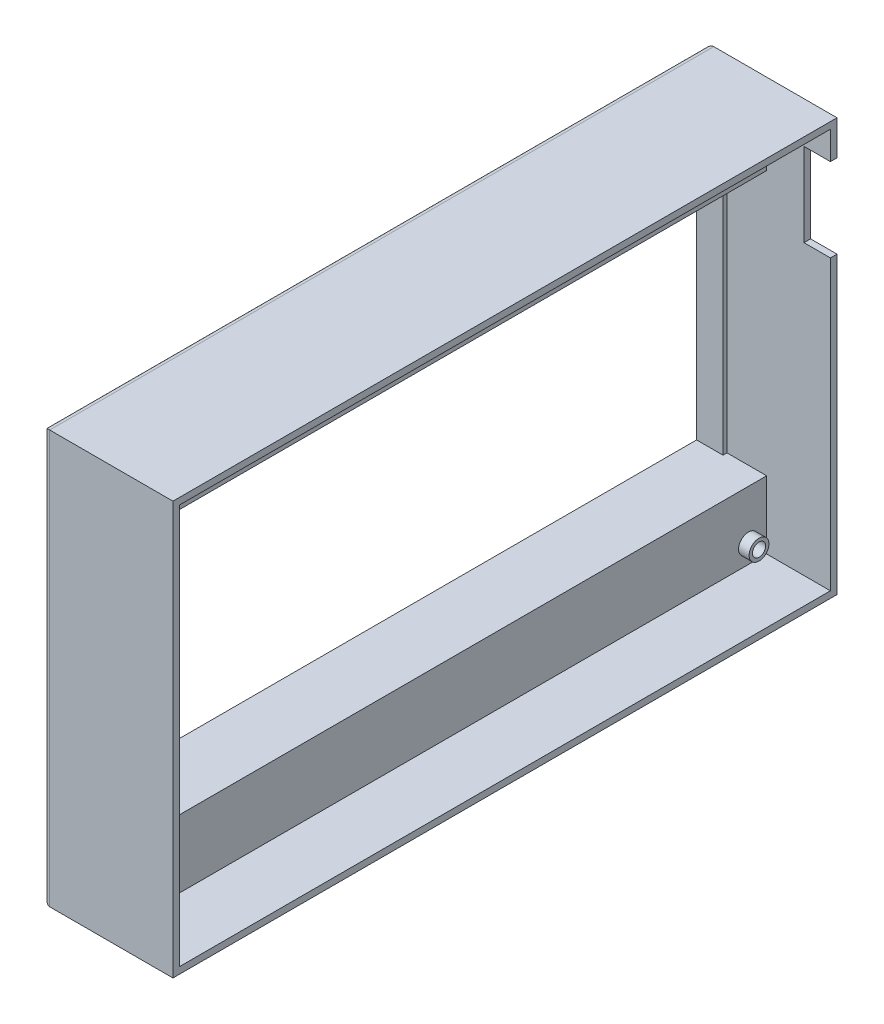
ISO-10303-21;
HEADER;
FILE_DESCRIPTION(('STEP AP214'),'2;1');
FILE_NAME('part.step','',(''),(''),'','','');
FILE_SCHEMA(('AUTOMOTIVE_DESIGN { 1 0 10303 214 1 1 1 1 }'));
ENDSEC;
DATA;
#1=APPLICATION_CONTEXT('core data for automotive mechanical design processes');
#2=APPLICATION_PROTOCOL_DEFINITION('international standard','automotive_design',2000,#1);
#3=PRODUCT_CONTEXT('',#1,'mechanical');
#4=PRODUCT('Part','Part','',(#3));
#5=PRODUCT_RELATED_PRODUCT_CATEGORY('part','',(#4));
#6=PRODUCT_DEFINITION_FORMATION('','',#4);
#7=PRODUCT_DEFINITION_CONTEXT('part definition',#1,'design');
#8=PRODUCT_DEFINITION('design','',#6,#7);
#9=PRODUCT_DEFINITION_SHAPE('','',#8);
#10=(LENGTH_UNIT() NAMED_UNIT(*) SI_UNIT(.MILLI.,.METRE.));
#11=(NAMED_UNIT(*) PLANE_ANGLE_UNIT() SI_UNIT($,.RADIAN.));
#12=(NAMED_UNIT(*) SI_UNIT($,.STERADIAN.) SOLID_ANGLE_UNIT());
#13=UNCERTAINTY_MEASURE_WITH_UNIT(LENGTH_MEASURE(1.E-05),#10,'distance_accuracy_value','');
#14=(GEOMETRIC_REPRESENTATION_CONTEXT(3) GLOBAL_UNCERTAINTY_ASSIGNED_CONTEXT((#13)) GLOBAL_UNIT_ASSIGNED_CONTEXT((#10,
#11,#12)) REPRESENTATION_CONTEXT('',''));
#15=CARTESIAN_POINT('',(0.,0.,0.));
#16=DIRECTION('',(0.,0.,1.));
#17=DIRECTION('',(1.,0.,0.));
#18=AXIS2_PLACEMENT_3D('',#15,#16,#17);
#19=CARTESIAN_POINT('',(19.65,26.394578313253,-54.8336983050815));
#20=DIRECTION('',(0.,0.,-1.));
#21=DIRECTION('',(0.,1.,0.));
#22=AXIS2_PLACEMENT_3D('',#19,#20,#21);
#23=PLANE('',#22);
#24=DIRECTION('',(0.,-1.,0.));
#25=VECTOR('',#24,1.);
#26=CARTESIAN_POINT('',(19.65,26.394578313253,-54.8336983050815));
#27=LINE('',#26,#25);
#28=CARTESIAN_POINT('',(19.65,9.52457831325301,-54.8336983050815));
#29=VERTEX_POINT('',#28);
#30=CARTESIAN_POINT('',(19.65,-34.105421686747,-54.8336983050815));
#31=VERTEX_POINT('',#30);
#32=EDGE_CURVE('E210',#29,#31,#27,.T.);
#33=ORIENTED_EDGE('',*,*,#32,.F.);
#34=DIRECTION('',(1.,0.,0.));
#35=VECTOR('',#34,1.);
#36=CARTESIAN_POINT('',(15.65,9.52457831325301,-54.8336983050815));
#37=LINE('',#36,#35);
#38=CARTESIAN_POINT('',(15.65,9.52457831325301,-54.8336983050815));
#39=VERTEX_POINT('',#38);
#40=EDGE_CURVE('E202',#39,#29,#37,.T.);
#41=ORIENTED_EDGE('',*,*,#40,.F.);
#42=DIRECTION('',(0.,1.,0.));
#43=VECTOR('',#42,1.);
#44=CARTESIAN_POINT('',(15.65,26.394578313253,-54.8336983050815));
#45=LINE('',#44,#43);
#46=CARTESIAN_POINT('',(15.65,22.144578313253,-54.8336983050815));
#47=VERTEX_POINT('',#46);
#48=EDGE_CURVE('E187',#39,#47,#45,.T.);
#49=ORIENTED_EDGE('',*,*,#48,.T.);
#50=DIRECTION('',(1.,0.,0.));
#51=VECTOR('',#50,1.);
#52=CARTESIAN_POINT('',(19.65,22.144578313253,-54.8336983050815));
#53=LINE('',#52,#51);
#54=CARTESIAN_POINT('',(19.65,22.144578313253,-54.8336983050815));
#55=VERTEX_POINT('',#54);
#56=EDGE_CURVE('E197',#47,#55,#53,.T.);
#57=ORIENTED_EDGE('',*,*,#56,.T.);
#58=CARTESIAN_POINT('',(19.65,26.394578313253,-54.8336983050815));
#59=VERTEX_POINT('',#58);
#60=EDGE_CURVE('E312',#59,#55,#27,.T.);
#61=ORIENTED_EDGE('',*,*,#60,.F.);
#62=DIRECTION('',(-1.,0.,0.));
#63=VECTOR('',#62,1.);
#64=CARTESIAN_POINT('',(19.65,26.394578313253,-54.8336983050815));
#65=LINE('',#64,#63);
#66=CARTESIAN_POINT('',(10.,26.394578313253,-54.8336983050815));
#67=VERTEX_POINT('',#66);
#68=EDGE_CURVE('E325',#59,#67,#65,.T.);
#69=ORIENTED_EDGE('',*,*,#68,.T.);
#70=DIRECTION('',(0.,-1.,0.));
#71=VECTOR('',#70,1.);
#72=CARTESIAN_POINT('',(10.,26.394578313253,-54.8336983050815));
#73=LINE('',#72,#71);
#74=CARTESIAN_POINT('',(10.,16.144578313253,-54.8336983050815));
#75=VERTEX_POINT('',#74);
#76=EDGE_CURVE('E296',#67,#75,#73,.T.);
#77=ORIENTED_EDGE('',*,*,#76,.T.);
#78=DIRECTION('',(-1.,0.,0.));
#79=VECTOR('',#78,1.);
#80=CARTESIAN_POINT('',(10.,16.144578313253,-54.8336983050815));
#81=LINE('',#80,#79);
#82=CARTESIAN_POINT('',(4.,16.144578313253,-54.8336983050815));
#83=VERTEX_POINT('',#82);
#84=EDGE_CURVE('E304',#75,#83,#81,.T.);
#85=ORIENTED_EDGE('',*,*,#84,.T.);
#86=DIRECTION('',(0.,-1.,0.));
#87=VECTOR('',#86,1.);
#88=CARTESIAN_POINT('',(4.,-24.4397467502218,-54.8336983050815));
#89=LINE('',#88,#87);
#90=CARTESIAN_POINT('',(4.,-23.855421686747,-54.8336983050815));
#91=VERTEX_POINT('',#90);
#92=EDGE_CURVE('E248',#83,#91,#89,.T.);
#93=ORIENTED_EDGE('',*,*,#92,.T.);
#94=DIRECTION('',(-1.,0.,0.));
#95=VECTOR('',#94,1.);
#96=CARTESIAN_POINT('',(10.,-23.855421686747,-54.8336983050815));
#97=LINE('',#96,#95);
#98=CARTESIAN_POINT('',(10.,-23.855421686747,-54.8336983050815));
#99=VERTEX_POINT('',#98);
#100=EDGE_CURVE('E278',#99,#91,#97,.T.);
#101=ORIENTED_EDGE('',*,*,#100,.F.);
#102=DIRECTION('',(0.,-1.,0.));
#103=VECTOR('',#102,1.);
#104=CARTESIAN_POINT('',(10.,-23.855421686747,-54.8336983050815));
#105=LINE('',#104,#103);
#106=CARTESIAN_POINT('',(10.,-34.105421686747,-54.8336983050815));
#107=VERTEX_POINT('',#106);
#108=EDGE_CURVE('E268',#99,#107,#105,.T.);
#109=ORIENTED_EDGE('',*,*,#108,.T.);
#110=DIRECTION('',(-1.,0.,0.));
#111=VECTOR('',#110,1.);
#112=CARTESIAN_POINT('',(19.65,-34.105421686747,-54.8336983050815));
#113=LINE('',#112,#111);
#114=EDGE_CURVE('E324',#31,#107,#113,.T.);
#115=ORIENTED_EDGE('',*,*,#114,.F.);
#116=EDGE_LOOP('',(#33,#41,#49,#57,#61,#69,#77,#85,#93,#101,#109,#115));
#117=FACE_BOUND('',#116,.T.);
#118=ADVANCED_FACE('F36',(#117),#23,.F.);
#119=CARTESIAN_POINT('',(19.65,-34.105421686747,-54.8336983050815));
#120=DIRECTION('',(0.,-1.,0.));
#121=DIRECTION('',(0.,0.,-1.));
#122=AXIS2_PLACEMENT_3D('',#119,#120,#121);
#123=PLANE('',#122);
#124=DIRECTION('',(0.,0.,1.));
#125=VECTOR('',#124,1.);
#126=CARTESIAN_POINT('',(10.,-34.105421686747,-54.8336983050815));
#127=LINE('',#126,#125);
#128=CARTESIAN_POINT('',(10.,-34.105421686747,43.6663016949185));
#129=VERTEX_POINT('',#128);
#130=EDGE_CURVE('E270',#107,#129,#127,.T.);
#131=ORIENTED_EDGE('',*,*,#130,.T.);
#132=DIRECTION('',(-1.,0.,0.));
#133=VECTOR('',#132,1.);
#134=CARTESIAN_POINT('',(19.65,-34.105421686747,43.6663016949185));
#135=LINE('',#134,#133);
#136=CARTESIAN_POINT('',(19.65,-34.105421686747,43.6663016949185));
#137=VERTEX_POINT('',#136);
#138=EDGE_CURVE('E332',#137,#129,#135,.T.);
#139=ORIENTED_EDGE('',*,*,#138,.F.);
#140=DIRECTION('',(0.,0.,1.));
#141=VECTOR('',#140,1.);
#142=CARTESIAN_POINT('',(19.65,-34.105421686747,-54.8336983050815));
#143=LINE('',#142,#141);
#144=EDGE_CURVE('E315',#31,#137,#143,.T.);
#145=ORIENTED_EDGE('',*,*,#144,.F.);
#146=ORIENTED_EDGE('',*,*,#114,.T.);
#147=EDGE_LOOP('',(#131,#139,#145,#146));
#148=FACE_BOUND('',#147,.T.);
#149=ADVANCED_FACE('F491',(#148),#123,.F.);
#150=CARTESIAN_POINT('',(10.,0.,0.));
#151=DIRECTION('',(-1.,0.,0.));
#152=DIRECTION('',(0.,0.,1.));
#153=AXIS2_PLACEMENT_3D('',#150,#151,#152);
#154=PLANE('',#153);
#155=DIRECTION('',(0.,1.,0.));
#156=VECTOR('',#155,1.);
#157=CARTESIAN_POINT('',(10.,26.394578313253,43.6663016949185));
#158=LINE('',#157,#156);
#159=CARTESIAN_POINT('',(10.,16.144578313253,43.6663016949185));
#160=VERTEX_POINT('',#159);
#161=CARTESIAN_POINT('',(10.,26.394578313253,43.6663016949185));
#162=VERTEX_POINT('',#161);
#163=EDGE_CURVE('E300',#160,#162,#158,.T.);
#164=ORIENTED_EDGE('',*,*,#163,.F.);
#165=DIRECTION('',(0.,0.,1.));
#166=VECTOR('',#165,1.);
#167=CARTESIAN_POINT('',(10.,16.144578313253,-54.8336983050815));
#168=LINE('',#167,#166);
#169=EDGE_CURVE('E298',#75,#160,#168,.T.);
#170=ORIENTED_EDGE('',*,*,#169,.F.);
#171=ORIENTED_EDGE('',*,*,#76,.F.);
#172=DIRECTION('',(0.,0.,-1.));
#173=VECTOR('',#172,1.);
#174=CARTESIAN_POINT('',(10.,26.394578313253,-54.8336983050815));
#175=LINE('',#174,#173);
#176=EDGE_CURVE('E302',#162,#67,#175,.T.);
#177=ORIENTED_EDGE('',*,*,#176,.F.);
#178=EDGE_LOOP('',(#164,#170,#171,#177));
#179=FACE_BOUND('',#178,.T.);
#180=CARTESIAN_POINT('',(10.,23.644578313253,-52.0836983050815));
#181=DIRECTION('',(-1.,0.,0.));
#182=DIRECTION('',(0.,0.,1.));
#183=AXIS2_PLACEMENT_3D('',#180,#181,#182);
#184=CIRCLE('',#183,1.5);
#185=CARTESIAN_POINT('',(10.,23.644578313253,-50.5836983050815));
#186=VERTEX_POINT('',#185);
#187=EDGE_CURVE('E365',#186,#186,#184,.F.);
#188=ORIENTED_EDGE('',*,*,#187,.F.);
#189=EDGE_LOOP('',(#188));
#190=FACE_BOUND('',#189,.T.);
#191=CARTESIAN_POINT('',(10.,23.644578313253,40.9163016949185));
#192=DIRECTION('',(-1.,0.,0.));
#193=DIRECTION('',(0.,0.,1.));
#194=AXIS2_PLACEMENT_3D('',#191,#192,#193);
#195=CIRCLE('',#194,1.5);
#196=CARTESIAN_POINT('',(10.,23.644578313253,42.4163016949185));
#197=VERTEX_POINT('',#196);
#198=EDGE_CURVE('E368',#197,#197,#195,.F.);
#199=ORIENTED_EDGE('',*,*,#198,.F.);
#200=EDGE_LOOP('',(#199));
#201=FACE_BOUND('',#200,.T.);
#202=ADVANCED_FACE('F482',(#179,#190,#201),#154,.F.);
#203=CARTESIAN_POINT('',(19.65,26.394578313253,-54.8336983050815));
#204=DIRECTION('',(0.,1.,0.));
#205=DIRECTION('',(0.,0.,1.));
#206=AXIS2_PLACEMENT_3D('',#203,#204,#205);
#207=PLANE('',#206);
#208=ORIENTED_EDGE('',*,*,#176,.T.);
#209=ORIENTED_EDGE('',*,*,#68,.F.);
#210=DIRECTION('',(0.,0.,-1.));
#211=VECTOR('',#210,1.);
#212=CARTESIAN_POINT('',(19.65,26.394578313253,-54.8336983050815));
#213=LINE('',#212,#211);
#214=CARTESIAN_POINT('',(19.65,26.394578313253,43.6663016949185));
#215=VERTEX_POINT('',#214);
#216=EDGE_CURVE('E321',#215,#59,#213,.T.);
#217=ORIENTED_EDGE('',*,*,#216,.F.);
#218=DIRECTION('',(-1.,0.,0.));
#219=VECTOR('',#218,1.);
#220=CARTESIAN_POINT('',(19.65,26.394578313253,43.6663016949185));
#221=LINE('',#220,#219);
#222=EDGE_CURVE('E329',#215,#162,#221,.T.);
#223=ORIENTED_EDGE('',*,*,#222,.T.);
#224=EDGE_LOOP('',(#208,#209,#217,#223));
#225=FACE_BOUND('',#224,.T.);
#226=ADVANCED_FACE('F487',(#225),#207,.F.);
#227=CARTESIAN_POINT('',(19.65,27.394578313253,-55.8336983050815));
#228=DIRECTION('',(0.,0.,-1.));
#229=DIRECTION('',(0.,1.,0.));
#230=AXIS2_PLACEMENT_3D('',#227,#228,#229);
#231=PLANE('',#230);
#232=DIRECTION('',(1.,0.,0.));
#233=VECTOR('',#232,1.);
#234=CARTESIAN_POINT('',(15.65,9.52457831325301,-55.8336983050815));
#235=LINE('',#234,#233);
#236=CARTESIAN_POINT('',(15.65,9.52457831325301,-55.8336983050815));
#237=VERTEX_POINT('',#236);
#238=CARTESIAN_POINT('',(19.65,9.52457831325301,-55.8336983050815));
#239=VERTEX_POINT('',#238);
#240=EDGE_CURVE('E205',#237,#239,#235,.T.);
#241=ORIENTED_EDGE('',*,*,#240,.T.);
#242=DIRECTION('',(0.,-1.,0.));
#243=VECTOR('',#242,1.);
#244=CARTESIAN_POINT('',(19.65,27.394578313253,-55.8336983050815));
#245=LINE('',#244,#243);
#246=CARTESIAN_POINT('',(19.65,-35.105421686747,-55.8336983050815));
#247=VERTEX_POINT('',#246);
#248=EDGE_CURVE('E328',#239,#247,#245,.T.);
#249=ORIENTED_EDGE('',*,*,#248,.T.);
#250=DIRECTION('',(-1.,0.,0.));
#251=VECTOR('',#250,1.);
#252=CARTESIAN_POINT('',(19.65,-35.105421686747,-55.8336983050815));
#253=LINE('',#252,#251);
#254=CARTESIAN_POINT('',(1.,-35.105421686747,-55.8336983050815));
#255=VERTEX_POINT('',#254);
#256=EDGE_CURVE('E349',#247,#255,#253,.T.);
#257=ORIENTED_EDGE('',*,*,#256,.T.);
#258=DIRECTION('',(0.,-1.,0.));
#259=VECTOR('',#258,1.);
#260=CARTESIAN_POINT('',(1.,27.394578313253,-55.8336983050815));
#261=LINE('',#260,#259);
#262=CARTESIAN_POINT('',(1.,27.394578313253,-55.8336983050815));
#263=VERTEX_POINT('',#262);
#264=EDGE_CURVE('E45',#255,#263,#261,.F.);
#265=ORIENTED_EDGE('',*,*,#264,.T.);
#266=DIRECTION('',(-1.,0.,0.));
#267=VECTOR('',#266,1.);
#268=CARTESIAN_POINT('',(19.65,27.394578313253,-55.8336983050815));
#269=LINE('',#268,#267);
#270=CARTESIAN_POINT('',(19.65,27.394578313253,-55.8336983050815));
#271=VERTEX_POINT('',#270);
#272=EDGE_CURVE('E350',#271,#263,#269,.T.);
#273=ORIENTED_EDGE('',*,*,#272,.F.);
#274=CARTESIAN_POINT('',(19.65,22.144578313253,-55.8336983050815));
#275=VERTEX_POINT('',#274);
#276=EDGE_CURVE('E337',#271,#275,#245,.T.);
#277=ORIENTED_EDGE('',*,*,#276,.T.);
#278=DIRECTION('',(1.,0.,0.));
#279=VECTOR('',#278,1.);
#280=CARTESIAN_POINT('',(15.65,22.144578313253,-55.8336983050815));
#281=LINE('',#280,#279);
#282=CARTESIAN_POINT('',(15.65,22.144578313253,-55.8336983050815));
#283=VERTEX_POINT('',#282);
#284=EDGE_CURVE('E53',#283,#275,#281,.T.);
#285=ORIENTED_EDGE('',*,*,#284,.F.);
#286=DIRECTION('',(0.,1.,0.));
#287=VECTOR('',#286,1.);
#288=CARTESIAN_POINT('',(15.65,22.144578313253,-55.8336983050815));
#289=LINE('',#288,#287);
#290=EDGE_CURVE('E217',#237,#283,#289,.T.);
#291=ORIENTED_EDGE('',*,*,#290,.F.);
#292=EDGE_LOOP('',(#241,#249,#257,#265,#273,#277,#285,#291));
#293=FACE_BOUND('',#292,.T.);
#294=ADVANCED_FACE('F431',(#293),#231,.T.);
#295=CARTESIAN_POINT('',(19.65,27.394578313253,-55.8336983050815));
#296=DIRECTION('',(0.,1.,0.));
#297=DIRECTION('',(0.,0.,1.));
#298=AXIS2_PLACEMENT_3D('',#295,#296,#297);
#299=PLANE('',#298);
#300=ORIENTED_EDGE('',*,*,#272,.T.);
#301=DIRECTION('',(0.,0.,-1.));
#302=VECTOR('',#301,1.);
#303=CARTESIAN_POINT('',(1.,27.394578313253,-55.8336983050815));
#304=LINE('',#303,#302);
#305=CARTESIAN_POINT('',(1.,27.394578313253,44.6663016949185));
#306=VERTEX_POINT('',#305);
#307=EDGE_CURVE('E11',#263,#306,#304,.F.);
#308=ORIENTED_EDGE('',*,*,#307,.T.);
#309=DIRECTION('',(-1.,0.,0.));
#310=VECTOR('',#309,1.);
#311=CARTESIAN_POINT('',(19.65,27.394578313253,44.6663016949185));
#312=LINE('',#311,#310);
#313=CARTESIAN_POINT('',(19.65,27.394578313253,44.6663016949185));
#314=VERTEX_POINT('',#313);
#315=EDGE_CURVE('E353',#314,#306,#312,.T.);
#316=ORIENTED_EDGE('',*,*,#315,.F.);
#317=DIRECTION('',(0.,0.,-1.));
#318=VECTOR('',#317,1.);
#319=CARTESIAN_POINT('',(19.65,27.394578313253,-55.8336983050815));
#320=LINE('',#319,#318);
#321=EDGE_CURVE('E346',#314,#271,#320,.T.);
#322=ORIENTED_EDGE('',*,*,#321,.T.);
#323=EDGE_LOOP('',(#300,#308,#316,#322));
#324=FACE_BOUND('',#323,.T.);
#325=ADVANCED_FACE('F421',(#324),#299,.T.);
#326=CARTESIAN_POINT('',(19.65,27.394578313253,44.6663016949185));
#327=DIRECTION('',(0.,0.,1.));
#328=DIRECTION('',(0.,-1.,0.));
#329=AXIS2_PLACEMENT_3D('',#326,#327,#328);
#330=PLANE('',#329);
#331=ORIENTED_EDGE('',*,*,#315,.T.);
#332=DIRECTION('',(0.,1.,0.));
#333=VECTOR('',#332,1.);
#334=CARTESIAN_POINT('',(1.,27.394578313253,44.6663016949185));
#335=LINE('',#334,#333);
#336=CARTESIAN_POINT('',(1.,-35.105421686747,44.6663016949185));
#337=VERTEX_POINT('',#336);
#338=EDGE_CURVE('E400',#306,#337,#335,.F.);
#339=ORIENTED_EDGE('',*,*,#338,.T.);
#340=DIRECTION('',(-1.,0.,0.));
#341=VECTOR('',#340,1.);
#342=CARTESIAN_POINT('',(19.65,-35.105421686747,44.6663016949185));
#343=LINE('',#342,#341);
#344=CARTESIAN_POINT('',(19.65,-35.105421686747,44.6663016949185));
#345=VERTEX_POINT('',#344);
#346=EDGE_CURVE('E356',#345,#337,#343,.T.);
#347=ORIENTED_EDGE('',*,*,#346,.F.);
#348=DIRECTION('',(0.,1.,0.));
#349=VECTOR('',#348,1.);
#350=CARTESIAN_POINT('',(19.65,27.394578313253,44.6663016949185));
#351=LINE('',#350,#349);
#352=EDGE_CURVE('E343',#345,#314,#351,.T.);
#353=ORIENTED_EDGE('',*,*,#352,.T.);
#354=EDGE_LOOP('',(#331,#339,#347,#353));
#355=FACE_BOUND('',#354,.T.);
#356=ADVANCED_FACE('F423',(#355),#330,.T.);
#357=CARTESIAN_POINT('',(19.65,-35.105421686747,-55.8336983050815));
#358=DIRECTION('',(0.,-1.,0.));
#359=DIRECTION('',(0.,0.,-1.));
#360=AXIS2_PLACEMENT_3D('',#357,#358,#359);
#361=PLANE('',#360);
#362=ORIENTED_EDGE('',*,*,#346,.T.);
#363=DIRECTION('',(0.,0.,1.));
#364=VECTOR('',#363,1.);
#365=CARTESIAN_POINT('',(1.,-35.105421686747,-55.8336983050815));
#366=LINE('',#365,#364);
#367=EDGE_CURVE('E397',#337,#255,#366,.F.);
#368=ORIENTED_EDGE('',*,*,#367,.T.);
#369=ORIENTED_EDGE('',*,*,#256,.F.);
#370=DIRECTION('',(0.,0.,1.));
#371=VECTOR('',#370,1.);
#372=CARTESIAN_POINT('',(19.65,-35.105421686747,-55.8336983050815));
#373=LINE('',#372,#371);
#374=EDGE_CURVE('E340',#247,#345,#373,.T.);
#375=ORIENTED_EDGE('',*,*,#374,.T.);
#376=EDGE_LOOP('',(#362,#368,#369,#375));
#377=FACE_BOUND('',#376,.T.);
#378=ADVANCED_FACE('F434',(#377),#361,.T.);
#379=CARTESIAN_POINT('',(19.65,0.,0.));
#380=DIRECTION('',(-1.,0.,0.));
#381=DIRECTION('',(0.,0.,1.));
#382=AXIS2_PLACEMENT_3D('',#379,#380,#381);
#383=PLANE('',#382);
#384=ORIENTED_EDGE('',*,*,#248,.F.);
#385=DIRECTION('',(0.,0.,-1.));
#386=VECTOR('',#385,1.);
#387=CARTESIAN_POINT('',(19.65,9.52457831325301,-55.8336983050815));
#388=LINE('',#387,#386);
#389=EDGE_CURVE('E206',#29,#239,#388,.T.);
#390=ORIENTED_EDGE('',*,*,#389,.F.);
#391=ORIENTED_EDGE('',*,*,#32,.T.);
#392=ORIENTED_EDGE('',*,*,#144,.T.);
#393=DIRECTION('',(0.,1.,0.));
#394=VECTOR('',#393,1.);
#395=CARTESIAN_POINT('',(19.65,26.394578313253,43.6663016949185));
#396=LINE('',#395,#394);
#397=EDGE_CURVE('E318',#137,#215,#396,.T.);
#398=ORIENTED_EDGE('',*,*,#397,.T.);
#399=ORIENTED_EDGE('',*,*,#216,.T.);
#400=ORIENTED_EDGE('',*,*,#60,.T.);
#401=DIRECTION('',(0.,0.,1.));
#402=VECTOR('',#401,1.);
#403=CARTESIAN_POINT('',(19.65,22.144578313253,-54.8336983050815));
#404=LINE('',#403,#402);
#405=EDGE_CURVE('E212',#275,#55,#404,.T.);
#406=ORIENTED_EDGE('',*,*,#405,.F.);
#407=ORIENTED_EDGE('',*,*,#276,.F.);
#408=ORIENTED_EDGE('',*,*,#321,.F.);
#409=ORIENTED_EDGE('',*,*,#352,.F.);
#410=ORIENTED_EDGE('',*,*,#374,.F.);
#411=EDGE_LOOP('',(#384,#390,#391,#392,#398,#399,#400,#406,#407,#408,#409,#410));
#412=FACE_BOUND('',#411,.T.);
#413=ADVANCED_FACE('F430',(#412),#383,.F.);
#414=CARTESIAN_POINT('',(0.,0.,0.));
#415=DIRECTION('',(-1.,0.,0.));
#416=DIRECTION('',(0.,0.,1.));
#417=AXIS2_PLACEMENT_3D('',#414,#415,#416);
#418=PLANE('',#417);
#419=DIRECTION('',(0.,-1.,0.));
#420=VECTOR('',#419,1.);
#421=CARTESIAN_POINT('',(0.,0.,-54.8336983050815));
#422=LINE('',#421,#420);
#423=CARTESIAN_POINT('',(0.,26.394578313253,-54.8336983050815));
#424=VERTEX_POINT('',#423);
#425=CARTESIAN_POINT('',(0.,-34.105421686747,-54.8336983050815));
#426=VERTEX_POINT('',#425);
#427=EDGE_CURVE('E390',#424,#426,#422,.T.);
#428=ORIENTED_EDGE('',*,*,#427,.T.);
#429=DIRECTION('',(0.,0.,1.));
#430=VECTOR('',#429,1.);
#431=CARTESIAN_POINT('',(0.,-34.105421686747,0.));
#432=LINE('',#431,#430);
#433=CARTESIAN_POINT('',(0.,-34.105421686747,43.6663016949185));
#434=VERTEX_POINT('',#433);
#435=EDGE_CURVE('E394',#426,#434,#432,.T.);
#436=ORIENTED_EDGE('',*,*,#435,.T.);
#437=DIRECTION('',(0.,1.,0.));
#438=VECTOR('',#437,1.);
#439=CARTESIAN_POINT('',(0.,0.,43.6663016949185));
#440=LINE('',#439,#438);
#441=CARTESIAN_POINT('',(0.,26.394578313253,43.6663016949185));
#442=VERTEX_POINT('',#441);
#443=EDGE_CURVE('E392',#434,#442,#440,.T.);
#444=ORIENTED_EDGE('',*,*,#443,.T.);
#445=DIRECTION('',(0.,0.,-1.));
#446=VECTOR('',#445,1.);
#447=CARTESIAN_POINT('',(0.,26.394578313253,0.));
#448=LINE('',#447,#446);
#449=EDGE_CURVE('E388',#442,#424,#448,.T.);
#450=ORIENTED_EDGE('',*,*,#449,.T.);
#451=EDGE_LOOP('',(#428,#436,#444,#450));
#452=FACE_BOUND('',#451,.T.);
#453=DIRECTION('',(0.,0.,1.));
#454=VECTOR('',#453,1.);
#455=CARTESIAN_POINT('',(0.,16.144578313253,-54.8336983050815));
#456=LINE('',#455,#454);
#457=CARTESIAN_POINT('',(0.,16.144578313253,-54.2336983050815));
#458=VERTEX_POINT('',#457);
#459=CARTESIAN_POINT('',(0.,16.144578313253,43.0663016949185));
#460=VERTEX_POINT('',#459);
#461=EDGE_CURVE('E293',#458,#460,#456,.T.);
#462=ORIENTED_EDGE('',*,*,#461,.T.);
#463=DIRECTION('',(0.,-1.,0.));
#464=VECTOR('',#463,1.);
#465=CARTESIAN_POINT('',(0.,-23.855421686747,43.0663016949185));
#466=LINE('',#465,#464);
#467=CARTESIAN_POINT('',(0.,-23.855421686747,43.0663016949185));
#468=VERTEX_POINT('',#467);
#469=EDGE_CURVE('E226',#460,#468,#466,.T.);
#470=ORIENTED_EDGE('',*,*,#469,.T.);
#471=DIRECTION('',(0.,0.,-1.));
#472=VECTOR('',#471,1.);
#473=CARTESIAN_POINT('',(0.,-23.855421686747,-54.8336983050815));
#474=LINE('',#473,#472);
#475=CARTESIAN_POINT('',(0.,-23.855421686747,-54.2336983050815));
#476=VERTEX_POINT('',#475);
#477=EDGE_CURVE('E267',#468,#476,#474,.T.);
#478=ORIENTED_EDGE('',*,*,#477,.T.);
#479=DIRECTION('',(0.,1.,0.));
#480=VECTOR('',#479,1.);
#481=CARTESIAN_POINT('',(0.,-24.4397467502218,-54.2336983050815));
#482=LINE('',#481,#480);
#483=EDGE_CURVE('E240',#476,#458,#482,.T.);
#484=ORIENTED_EDGE('',*,*,#483,.T.);
#485=EDGE_LOOP('',(#462,#470,#478,#484));
#486=FACE_BOUND('',#485,.T.);
#487=ADVANCED_FACE('F442',(#452,#486),#418,.T.);
#488=CARTESIAN_POINT('',(19.65,26.394578313253,43.6663016949185));
#489=DIRECTION('',(0.,0.,1.));
#490=DIRECTION('',(0.,-1.,0.));
#491=AXIS2_PLACEMENT_3D('',#488,#489,#490);
#492=PLANE('',#491);
#493=DIRECTION('',(-1.,0.,0.));
#494=VECTOR('',#493,1.);
#495=CARTESIAN_POINT('',(10.,-23.855421686747,43.6663016949185));
#496=LINE('',#495,#494);
#497=CARTESIAN_POINT('',(10.,-23.855421686747,43.6663016949185));
#498=VERTEX_POINT('',#497);
#499=CARTESIAN_POINT('',(4.,-23.855421686747,43.6663016949185));
#500=VERTEX_POINT('',#499);
#501=EDGE_CURVE('E276',#498,#500,#496,.T.);
#502=ORIENTED_EDGE('',*,*,#501,.T.);
#503=DIRECTION('',(0.,1.,0.));
#504=VECTOR('',#503,1.);
#505=CARTESIAN_POINT('',(4.,-23.855421686747,43.6663016949185));
#506=LINE('',#505,#504);
#507=CARTESIAN_POINT('',(4.,16.144578313253,43.6663016949185));
#508=VERTEX_POINT('',#507);
#509=EDGE_CURVE('E229',#500,#508,#506,.T.);
#510=ORIENTED_EDGE('',*,*,#509,.T.);
#511=DIRECTION('',(-1.,0.,0.));
#512=VECTOR('',#511,1.);
#513=CARTESIAN_POINT('',(10.,16.144578313253,43.6663016949185));
#514=LINE('',#513,#512);
#515=EDGE_CURVE('E307',#160,#508,#514,.T.);
#516=ORIENTED_EDGE('',*,*,#515,.F.);
#517=ORIENTED_EDGE('',*,*,#163,.T.);
#518=ORIENTED_EDGE('',*,*,#222,.F.);
#519=ORIENTED_EDGE('',*,*,#397,.F.);
#520=ORIENTED_EDGE('',*,*,#138,.T.);
#521=DIRECTION('',(0.,1.,0.));
#522=VECTOR('',#521,1.);
#523=CARTESIAN_POINT('',(10.,-23.855421686747,43.6663016949185));
#524=LINE('',#523,#522);
#525=EDGE_CURVE('E272',#129,#498,#524,.T.);
#526=ORIENTED_EDGE('',*,*,#525,.T.);
#527=EDGE_LOOP('',(#502,#510,#516,#517,#518,#519,#520,#526));
#528=FACE_BOUND('',#527,.T.);
#529=ADVANCED_FACE('F445',(#528),#492,.F.);
#530=CARTESIAN_POINT('',(10.,16.144578313253,-54.8336983050815));
#531=DIRECTION('',(0.,-1.,0.));
#532=DIRECTION('',(0.,0.,-1.));
#533=AXIS2_PLACEMENT_3D('',#530,#531,#532);
#534=PLANE('',#533);
#535=DIRECTION('',(-1.,0.,0.));
#536=VECTOR('',#535,1.);
#537=CARTESIAN_POINT('',(4.,16.144578313253,43.0663016949185));
#538=LINE('',#537,#536);
#539=CARTESIAN_POINT('',(4.,16.144578313253,43.0663016949185));
#540=VERTEX_POINT('',#539);
#541=EDGE_CURVE('E237',#540,#460,#538,.T.);
#542=ORIENTED_EDGE('',*,*,#541,.T.);
#543=ORIENTED_EDGE('',*,*,#461,.F.);
#544=DIRECTION('',(-1.,0.,0.));
#545=VECTOR('',#544,1.);
#546=CARTESIAN_POINT('',(4.,16.144578313253,-54.2336983050815));
#547=LINE('',#546,#545);
#548=CARTESIAN_POINT('',(4.,16.144578313253,-54.2336983050815));
#549=VERTEX_POINT('',#548);
#550=EDGE_CURVE('E251',#549,#458,#547,.T.);
#551=ORIENTED_EDGE('',*,*,#550,.F.);
#552=DIRECTION('',(0.,0.,-1.));
#553=VECTOR('',#552,1.);
#554=CARTESIAN_POINT('',(4.,16.144578313253,-54.2336983050815));
#555=LINE('',#554,#553);
#556=EDGE_CURVE('E245',#549,#83,#555,.T.);
#557=ORIENTED_EDGE('',*,*,#556,.T.);
#558=ORIENTED_EDGE('',*,*,#84,.F.);
#559=ORIENTED_EDGE('',*,*,#169,.T.);
#560=ORIENTED_EDGE('',*,*,#515,.T.);
#561=DIRECTION('',(0.,0.,-1.));
#562=VECTOR('',#561,1.);
#563=CARTESIAN_POINT('',(4.,16.144578313253,43.0663016949185));
#564=LINE('',#563,#562);
#565=EDGE_CURVE('E232',#508,#540,#564,.T.);
#566=ORIENTED_EDGE('',*,*,#565,.T.);
#567=EDGE_LOOP('',(#542,#543,#551,#557,#558,#559,#560,#566));
#568=FACE_BOUND('',#567,.T.);
#569=ADVANCED_FACE('F451',(#568),#534,.T.);
#570=CARTESIAN_POINT('',(11.6,23.644578313253,40.9163016949185));
#571=DIRECTION('',(-1.,0.,0.));
#572=DIRECTION('',(0.,0.,1.));
#573=AXIS2_PLACEMENT_3D('',#570,#571,#572);
#574=CYLINDRICAL_SURFACE('',#573,1.5);
#575=CARTESIAN_POINT('',(11.6,23.644578313253,40.9163016949185));
#576=DIRECTION('',(1.,0.,0.));
#577=DIRECTION('',(0.,0.,-1.));
#578=AXIS2_PLACEMENT_3D('',#575,#576,#577);
#579=CIRCLE('',#578,1.5);
#580=CARTESIAN_POINT('',(11.6,23.644578313253,39.4163016949185));
#581=VERTEX_POINT('',#580);
#582=EDGE_CURVE('E281',#581,#581,#579,.T.);
#583=ORIENTED_EDGE('',*,*,#582,.F.);
#584=EDGE_LOOP('',(#583));
#585=FACE_BOUND('',#584,.T.);
#586=ORIENTED_EDGE('',*,*,#198,.T.);
#587=EDGE_LOOP('',(#586));
#588=FACE_BOUND('',#587,.T.);
#589=ADVANCED_FACE('F570',(#585,#588),#574,.T.);
#590=CARTESIAN_POINT('',(11.6,23.644578313253,40.9163016949185));
#591=DIRECTION('',(1.,0.,0.));
#592=DIRECTION('',(0.,0.,-1.));
#593=AXIS2_PLACEMENT_3D('',#590,#591,#592);
#594=PLANE('',#593);
#595=CARTESIAN_POINT('',(11.6,23.644578313253,40.9163016949185));
#596=DIRECTION('',(1.,0.,0.));
#597=DIRECTION('',(0.,0.,-1.));
#598=AXIS2_PLACEMENT_3D('',#595,#596,#597);
#599=CIRCLE('',#598,0.999999999999998);
#600=CARTESIAN_POINT('',(11.6,23.644578313253,39.9163016949185));
#601=VERTEX_POINT('',#600);
#602=EDGE_CURVE('E290',#601,#601,#599,.T.);
#603=ORIENTED_EDGE('',*,*,#602,.F.);
#604=EDGE_LOOP('',(#603));
#605=FACE_BOUND('',#604,.T.);
#606=ORIENTED_EDGE('',*,*,#582,.T.);
#607=EDGE_LOOP('',(#606));
#608=FACE_BOUND('',#607,.T.);
#609=ADVANCED_FACE('F573',(#605,#608),#594,.T.);
#610=CARTESIAN_POINT('',(9.6,23.644578313253,40.9163016949185));
#611=DIRECTION('',(1.,0.,0.));
#612=DIRECTION('',(0.,0.,-1.));
#613=AXIS2_PLACEMENT_3D('',#610,#611,#612);
#614=CYLINDRICAL_SURFACE('',#613,0.999999999999998);
#615=ORIENTED_EDGE('',*,*,#602,.T.);
#616=EDGE_LOOP('',(#615));
#617=FACE_BOUND('',#616,.T.);
#618=CARTESIAN_POINT('',(10.,23.644578313253,40.9163016949185));
#619=DIRECTION('',(-1.,0.,0.));
#620=DIRECTION('',(0.,0.,1.));
#621=AXIS2_PLACEMENT_3D('',#618,#619,#620);
#622=CIRCLE('',#621,0.999999999999998);
#623=CARTESIAN_POINT('',(10.,23.644578313253,41.9163016949185));
#624=VERTEX_POINT('',#623);
#625=EDGE_CURVE('E352',#624,#624,#622,.T.);
#626=ORIENTED_EDGE('',*,*,#625,.T.);
#627=EDGE_LOOP('',(#626));
#628=FACE_BOUND('',#627,.T.);
#629=ADVANCED_FACE('F577',(#617,#628),#614,.F.);
#630=ORIENTED_EDGE('',*,*,#625,.F.);
#631=EDGE_LOOP('',(#630));
#632=FACE_BOUND('',#631,.T.);
#633=ADVANCED_FACE('F500',(#632),#154,.F.);
#634=CARTESIAN_POINT('',(9.6,23.644578313253,-52.0836983050815));
#635=DIRECTION('',(1.,0.,0.));
#636=DIRECTION('',(0.,0.,-1.));
#637=AXIS2_PLACEMENT_3D('',#634,#635,#636);
#638=CYLINDRICAL_SURFACE('',#637,0.999999999999998);
#639=CARTESIAN_POINT('',(11.6,23.644578313253,-52.0836983050815));
#640=DIRECTION('',(1.,0.,0.));
#641=DIRECTION('',(0.,0.,-1.));
#642=AXIS2_PLACEMENT_3D('',#639,#640,#641);
#643=CIRCLE('',#642,0.999999999999998);
#644=CARTESIAN_POINT('',(11.6,23.644578313253,-53.0836983050815));
#645=VERTEX_POINT('',#644);
#646=EDGE_CURVE('E289',#645,#645,#643,.T.);
#647=ORIENTED_EDGE('',*,*,#646,.T.);
#648=EDGE_LOOP('',(#647));
#649=FACE_BOUND('',#648,.T.);
#650=CARTESIAN_POINT('',(10.,23.644578313253,-52.0836983050815));
#651=DIRECTION('',(-1.,0.,0.));
#652=DIRECTION('',(0.,0.,1.));
#653=AXIS2_PLACEMENT_3D('',#650,#651,#652);
#654=CIRCLE('',#653,0.999999999999998);
#655=CARTESIAN_POINT('',(10.,23.644578313253,-51.0836983050815));
#656=VERTEX_POINT('',#655);
#657=EDGE_CURVE('E362',#656,#656,#654,.T.);
#658=ORIENTED_EDGE('',*,*,#657,.T.);
#659=EDGE_LOOP('',(#658));
#660=FACE_BOUND('',#659,.T.);
#661=ADVANCED_FACE('F583',(#649,#660),#638,.F.);
#662=CARTESIAN_POINT('',(11.6,23.644578313253,-52.0836983050815));
#663=DIRECTION('',(-1.,0.,0.));
#664=DIRECTION('',(0.,0.,1.));
#665=AXIS2_PLACEMENT_3D('',#662,#663,#664);
#666=CYLINDRICAL_SURFACE('',#665,1.5);
#667=CARTESIAN_POINT('',(11.6,23.644578313253,-52.0836983050815));
#668=DIRECTION('',(1.,0.,0.));
#669=DIRECTION('',(0.,0.,1.));
#670=AXIS2_PLACEMENT_3D('',#667,#668,#669);
#671=CIRCLE('',#670,1.5);
#672=CARTESIAN_POINT('',(11.6,23.644578313253,-50.5836983050815));
#673=VERTEX_POINT('',#672);
#674=EDGE_CURVE('E286',#673,#673,#671,.T.);
#675=ORIENTED_EDGE('',*,*,#674,.F.);
#676=EDGE_LOOP('',(#675));
#677=FACE_BOUND('',#676,.T.);
#678=ORIENTED_EDGE('',*,*,#187,.T.);
#679=EDGE_LOOP('',(#678));
#680=FACE_BOUND('',#679,.T.);
#681=ADVANCED_FACE('F579',(#677,#680),#666,.T.);
#682=CARTESIAN_POINT('',(11.6,23.644578313253,-52.0836983050815));
#683=DIRECTION('',(-1.,0.,0.));
#684=DIRECTION('',(0.,0.,1.));
#685=AXIS2_PLACEMENT_3D('',#682,#683,#684);
#686=PLANE('',#685);
#687=ORIENTED_EDGE('',*,*,#646,.F.);
#688=EDGE_LOOP('',(#687));
#689=FACE_BOUND('',#688,.T.);
#690=ORIENTED_EDGE('',*,*,#674,.T.);
#691=EDGE_LOOP('',(#690));
#692=FACE_BOUND('',#691,.T.);
#693=ADVANCED_FACE('F582',(#689,#692),#686,.F.);
#694=ORIENTED_EDGE('',*,*,#657,.F.);
#695=EDGE_LOOP('',(#694));
#696=FACE_BOUND('',#695,.T.);
#697=ADVANCED_FACE('F499',(#696),#154,.F.);
#698=CARTESIAN_POINT('',(10.,-23.855421686747,-54.8336983050815));
#699=DIRECTION('',(0.,1.,0.));
#700=DIRECTION('',(0.,0.,1.));
#701=AXIS2_PLACEMENT_3D('',#698,#699,#700);
#702=PLANE('',#701);
#703=DIRECTION('',(-1.,0.,0.));
#704=VECTOR('',#703,1.);
#705=CARTESIAN_POINT('',(4.,-23.855421686747,43.0663016949185));
#706=LINE('',#705,#704);
#707=CARTESIAN_POINT('',(4.,-23.855421686747,43.0663016949185));
#708=VERTEX_POINT('',#707);
#709=EDGE_CURVE('E235',#708,#468,#706,.T.);
#710=ORIENTED_EDGE('',*,*,#709,.F.);
#711=DIRECTION('',(0.,0.,1.));
#712=VECTOR('',#711,1.);
#713=CARTESIAN_POINT('',(4.,-23.855421686747,43.0663016949185));
#714=LINE('',#713,#712);
#715=EDGE_CURVE('E225',#708,#500,#714,.T.);
#716=ORIENTED_EDGE('',*,*,#715,.T.);
#717=ORIENTED_EDGE('',*,*,#501,.F.);
#718=DIRECTION('',(0.,0.,-1.));
#719=VECTOR('',#718,1.);
#720=CARTESIAN_POINT('',(10.,-23.855421686747,-54.8336983050815));
#721=LINE('',#720,#719);
#722=EDGE_CURVE('E274',#498,#99,#721,.T.);
#723=ORIENTED_EDGE('',*,*,#722,.T.);
#724=ORIENTED_EDGE('',*,*,#100,.T.);
#725=DIRECTION('',(0.,0.,1.));
#726=VECTOR('',#725,1.);
#727=CARTESIAN_POINT('',(4.,-23.855421686747,-54.8336983050815));
#728=LINE('',#727,#726);
#729=CARTESIAN_POINT('',(4.,-23.855421686747,-54.2336983050815));
#730=VERTEX_POINT('',#729);
#731=EDGE_CURVE('E383',#91,#730,#728,.T.);
#732=ORIENTED_EDGE('',*,*,#731,.T.);
#733=DIRECTION('',(1.,0.,0.));
#734=VECTOR('',#733,1.);
#735=CARTESIAN_POINT('',(10.,-23.855421686747,-54.2336983050815));
#736=LINE('',#735,#734);
#737=EDGE_CURVE('E386',#476,#730,#736,.T.);
#738=ORIENTED_EDGE('',*,*,#737,.F.);
#739=ORIENTED_EDGE('',*,*,#477,.F.);
#740=EDGE_LOOP('',(#710,#716,#717,#723,#724,#732,#738,#739));
#741=FACE_BOUND('',#740,.T.);
#742=ADVANCED_FACE('F460',(#741),#702,.T.);
#743=CARTESIAN_POINT('',(10.,0.,0.));
#744=DIRECTION('',(-1.,0.,0.));
#745=DIRECTION('',(0.,0.,1.));
#746=AXIS2_PLACEMENT_3D('',#743,#744,#745);
#747=PLANE('',#746);
#748=ORIENTED_EDGE('',*,*,#108,.F.);
#749=ORIENTED_EDGE('',*,*,#722,.F.);
#750=ORIENTED_EDGE('',*,*,#525,.F.);
#751=ORIENTED_EDGE('',*,*,#130,.F.);
#752=EDGE_LOOP('',(#748,#749,#750,#751));
#753=FACE_BOUND('',#752,.T.);
#754=CARTESIAN_POINT('',(10.,-31.355421686747,40.9163016949185));
#755=DIRECTION('',(-1.,0.,0.));
#756=DIRECTION('',(0.,0.,1.));
#757=AXIS2_PLACEMENT_3D('',#754,#755,#756);
#758=CIRCLE('',#757,1.5);
#759=CARTESIAN_POINT('',(10.,-31.355421686747,42.4163016949185));
#760=VERTEX_POINT('',#759);
#761=EDGE_CURVE('E371',#760,#760,#758,.F.);
#762=ORIENTED_EDGE('',*,*,#761,.F.);
#763=EDGE_LOOP('',(#762));
#764=FACE_BOUND('',#763,.T.);
#765=CARTESIAN_POINT('',(10.,-31.355421686747,-52.0836983050815));
#766=DIRECTION('',(-1.,0.,0.));
#767=DIRECTION('',(0.,0.,1.));
#768=AXIS2_PLACEMENT_3D('',#765,#766,#767);
#769=CIRCLE('',#768,1.5);
#770=CARTESIAN_POINT('',(10.,-31.355421686747,-50.5836983050815));
#771=VERTEX_POINT('',#770);
#772=EDGE_CURVE('E374',#771,#771,#769,.F.);
#773=ORIENTED_EDGE('',*,*,#772,.F.);
#774=EDGE_LOOP('',(#773));
#775=FACE_BOUND('',#774,.T.);
#776=ADVANCED_FACE('F470',(#753,#764,#775),#747,.F.);
#777=CARTESIAN_POINT('',(9.6,-31.355421686747,40.9163016949185));
#778=DIRECTION('',(1.,0.,0.));
#779=DIRECTION('',(0.,0.,-1.));
#780=AXIS2_PLACEMENT_3D('',#777,#778,#779);
#781=CYLINDRICAL_SURFACE('',#780,0.999999999999998);
#782=CARTESIAN_POINT('',(11.6,-31.355421686747,40.9163016949185));
#783=DIRECTION('',(1.,0.,0.));
#784=DIRECTION('',(0.,0.,-1.));
#785=AXIS2_PLACEMENT_3D('',#782,#783,#784);
#786=CIRCLE('',#785,0.999999999999998);
#787=CARTESIAN_POINT('',(11.6,-31.355421686747,39.9163016949185));
#788=VERTEX_POINT('',#787);
#789=EDGE_CURVE('E255',#788,#788,#786,.T.);
#790=ORIENTED_EDGE('',*,*,#789,.T.);
#791=EDGE_LOOP('',(#790));
#792=FACE_BOUND('',#791,.T.);
#793=CARTESIAN_POINT('',(10.,-31.355421686747,40.9163016949185));
#794=DIRECTION('',(-1.,0.,0.));
#795=DIRECTION('',(0.,0.,1.));
#796=AXIS2_PLACEMENT_3D('',#793,#794,#795);
#797=CIRCLE('',#796,0.999999999999998);
#798=CARTESIAN_POINT('',(10.,-31.355421686747,41.9163016949185));
#799=VERTEX_POINT('',#798);
#800=EDGE_CURVE('E377',#799,#799,#797,.T.);
#801=ORIENTED_EDGE('',*,*,#800,.T.);
#802=EDGE_LOOP('',(#801));
#803=FACE_BOUND('',#802,.T.);
#804=ADVANCED_FACE('F547',(#792,#803),#781,.F.);
#805=CARTESIAN_POINT('',(11.6,-31.355421686747,40.9163016949185));
#806=DIRECTION('',(-1.,0.,0.));
#807=DIRECTION('',(0.,0.,1.));
#808=AXIS2_PLACEMENT_3D('',#805,#806,#807);
#809=PLANE('',#808);
#810=ORIENTED_EDGE('',*,*,#789,.F.);
#811=EDGE_LOOP('',(#810));
#812=FACE_BOUND('',#811,.T.);
#813=CARTESIAN_POINT('',(11.6,-31.355421686747,40.9163016949185));
#814=DIRECTION('',(1.,0.,0.));
#815=DIRECTION('',(0.,0.,1.));
#816=AXIS2_PLACEMENT_3D('',#813,#814,#815);
#817=CIRCLE('',#816,1.5);
#818=CARTESIAN_POINT('',(11.6,-31.355421686747,42.4163016949185));
#819=VERTEX_POINT('',#818);
#820=EDGE_CURVE('E259',#819,#819,#817,.T.);
#821=ORIENTED_EDGE('',*,*,#820,.T.);
#822=EDGE_LOOP('',(#821));
#823=FACE_BOUND('',#822,.T.);
#824=ADVANCED_FACE('F550',(#812,#823),#809,.F.);
#825=CARTESIAN_POINT('',(11.6,-31.355421686747,40.9163016949185));
#826=DIRECTION('',(-1.,0.,0.));
#827=DIRECTION('',(0.,0.,1.));
#828=AXIS2_PLACEMENT_3D('',#825,#826,#827);
#829=CYLINDRICAL_SURFACE('',#828,1.5);
#830=ORIENTED_EDGE('',*,*,#820,.F.);
#831=EDGE_LOOP('',(#830));
#832=FACE_BOUND('',#831,.T.);
#833=ORIENTED_EDGE('',*,*,#761,.T.);
#834=EDGE_LOOP('',(#833));
#835=FACE_BOUND('',#834,.T.);
#836=ADVANCED_FACE('F545',(#832,#835),#829,.T.);
#837=CARTESIAN_POINT('',(9.6,-31.355421686747,-52.0836983050815));
#838=DIRECTION('',(1.,0.,0.));
#839=DIRECTION('',(0.,0.,-1.));
#840=AXIS2_PLACEMENT_3D('',#837,#838,#839);
#841=CYLINDRICAL_SURFACE('',#840,0.999999999999998);
#842=CARTESIAN_POINT('',(11.6,-31.355421686747,-52.0836983050815));
#843=DIRECTION('',(1.,0.,0.));
#844=DIRECTION('',(0.,0.,-1.));
#845=AXIS2_PLACEMENT_3D('',#842,#843,#844);
#846=CIRCLE('',#845,0.999999999999998);
#847=CARTESIAN_POINT('',(11.6,-31.355421686747,-53.0836983050815));
#848=VERTEX_POINT('',#847);
#849=EDGE_CURVE('E256',#848,#848,#846,.T.);
#850=ORIENTED_EDGE('',*,*,#849,.T.);
#851=EDGE_LOOP('',(#850));
#852=FACE_BOUND('',#851,.T.);
#853=CARTESIAN_POINT('',(10.,-31.355421686747,-52.0836983050815));
#854=DIRECTION('',(-1.,0.,0.));
#855=DIRECTION('',(0.,0.,1.));
#856=AXIS2_PLACEMENT_3D('',#853,#854,#855);
#857=CIRCLE('',#856,0.999999999999998);
#858=CARTESIAN_POINT('',(10.,-31.355421686747,-51.0836983050815));
#859=VERTEX_POINT('',#858);
#860=EDGE_CURVE('E380',#859,#859,#857,.T.);
#861=ORIENTED_EDGE('',*,*,#860,.T.);
#862=EDGE_LOOP('',(#861));
#863=FACE_BOUND('',#862,.T.);
#864=ADVANCED_FACE('F541',(#852,#863),#841,.F.);
#865=CARTESIAN_POINT('',(11.6,-31.355421686747,-52.0836983050815));
#866=DIRECTION('',(1.,0.,0.));
#867=DIRECTION('',(0.,0.,-1.));
#868=AXIS2_PLACEMENT_3D('',#865,#866,#867);
#869=PLANE('',#868);
#870=ORIENTED_EDGE('',*,*,#849,.F.);
#871=EDGE_LOOP('',(#870));
#872=FACE_BOUND('',#871,.T.);
#873=CARTESIAN_POINT('',(11.6,-31.355421686747,-52.0836983050815));
#874=DIRECTION('',(1.,0.,0.));
#875=DIRECTION('',(0.,0.,-1.));
#876=AXIS2_PLACEMENT_3D('',#873,#874,#875);
#877=CIRCLE('',#876,1.5);
#878=CARTESIAN_POINT('',(11.6,-31.355421686747,-53.5836983050815));
#879=VERTEX_POINT('',#878);
#880=EDGE_CURVE('E264',#879,#879,#877,.T.);
#881=ORIENTED_EDGE('',*,*,#880,.T.);
#882=EDGE_LOOP('',(#881));
#883=FACE_BOUND('',#882,.T.);
#884=ADVANCED_FACE('F544',(#872,#883),#869,.T.);
#885=CARTESIAN_POINT('',(11.6,-31.355421686747,-52.0836983050815));
#886=DIRECTION('',(-1.,0.,0.));
#887=DIRECTION('',(0.,0.,1.));
#888=AXIS2_PLACEMENT_3D('',#885,#886,#887);
#889=CYLINDRICAL_SURFACE('',#888,1.5);
#890=ORIENTED_EDGE('',*,*,#880,.F.);
#891=EDGE_LOOP('',(#890));
#892=FACE_BOUND('',#891,.T.);
#893=ORIENTED_EDGE('',*,*,#772,.T.);
#894=EDGE_LOOP('',(#893));
#895=FACE_BOUND('',#894,.T.);
#896=ADVANCED_FACE('F560',(#892,#895),#889,.T.);
#897=ORIENTED_EDGE('',*,*,#800,.F.);
#898=EDGE_LOOP('',(#897));
#899=FACE_BOUND('',#898,.T.);
#900=ADVANCED_FACE('F564',(#899),#747,.F.);
#901=ORIENTED_EDGE('',*,*,#860,.F.);
#902=EDGE_LOOP('',(#901));
#903=FACE_BOUND('',#902,.T.);
#904=ADVANCED_FACE('F539',(#903),#747,.F.);
#905=CARTESIAN_POINT('',(4.,-24.4397467502218,-54.2336983050815));
#906=DIRECTION('',(0.,0.,1.));
#907=DIRECTION('',(1.,0.,0.));
#908=AXIS2_PLACEMENT_3D('',#905,#906,#907);
#909=PLANE('',#908);
#910=ORIENTED_EDGE('',*,*,#483,.F.);
#911=ORIENTED_EDGE('',*,*,#737,.T.);
#912=DIRECTION('',(0.,1.,0.));
#913=VECTOR('',#912,1.);
#914=CARTESIAN_POINT('',(4.,-24.4397467502218,-54.2336983050815));
#915=LINE('',#914,#913);
#916=EDGE_CURVE('E243',#730,#549,#915,.T.);
#917=ORIENTED_EDGE('',*,*,#916,.T.);
#918=ORIENTED_EDGE('',*,*,#550,.T.);
#919=EDGE_LOOP('',(#910,#911,#917,#918));
#920=FACE_BOUND('',#919,.T.);
#921=ADVANCED_FACE('F536',(#920),#909,.T.);
#922=CARTESIAN_POINT('',(4.,0.,0.));
#923=DIRECTION('',(-1.,0.,0.));
#924=DIRECTION('',(0.,0.,1.));
#925=AXIS2_PLACEMENT_3D('',#922,#923,#924);
#926=PLANE('',#925);
#927=ORIENTED_EDGE('',*,*,#731,.F.);
#928=ORIENTED_EDGE('',*,*,#92,.F.);
#929=ORIENTED_EDGE('',*,*,#556,.F.);
#930=ORIENTED_EDGE('',*,*,#916,.F.);
#931=EDGE_LOOP('',(#927,#928,#929,#930));
#932=FACE_BOUND('',#931,.T.);
#933=ADVANCED_FACE('F476',(#932),#926,.F.);
#934=CARTESIAN_POINT('',(4.,-23.855421686747,43.0663016949185));
#935=DIRECTION('',(0.,0.,-1.));
#936=DIRECTION('',(-1.,0.,0.));
#937=AXIS2_PLACEMENT_3D('',#934,#935,#936);
#938=PLANE('',#937);
#939=ORIENTED_EDGE('',*,*,#469,.F.);
#940=ORIENTED_EDGE('',*,*,#541,.F.);
#941=DIRECTION('',(0.,-1.,0.));
#942=VECTOR('',#941,1.);
#943=CARTESIAN_POINT('',(4.,-23.855421686747,43.0663016949185));
#944=LINE('',#943,#942);
#945=EDGE_CURVE('E222',#540,#708,#944,.T.);
#946=ORIENTED_EDGE('',*,*,#945,.T.);
#947=ORIENTED_EDGE('',*,*,#709,.T.);
#948=EDGE_LOOP('',(#939,#940,#946,#947));
#949=FACE_BOUND('',#948,.T.);
#950=ADVANCED_FACE('F454',(#949),#938,.T.);
#951=CARTESIAN_POINT('',(4.,0.,0.));
#952=DIRECTION('',(1.,0.,0.));
#953=DIRECTION('',(0.,0.,-1.));
#954=AXIS2_PLACEMENT_3D('',#951,#952,#953);
#955=PLANE('',#954);
#956=ORIENTED_EDGE('',*,*,#945,.F.);
#957=ORIENTED_EDGE('',*,*,#565,.F.);
#958=ORIENTED_EDGE('',*,*,#509,.F.);
#959=ORIENTED_EDGE('',*,*,#715,.F.);
#960=EDGE_LOOP('',(#956,#957,#958,#959));
#961=FACE_BOUND('',#960,.T.);
#962=ADVANCED_FACE('F457',(#961),#955,.T.);
#963=CARTESIAN_POINT('',(1.,26.394578313253,0.));
#964=DIRECTION('',(0.,0.,-1.));
#965=DIRECTION('',(-1.,0.,0.));
#966=AXIS2_PLACEMENT_3D('',#963,#964,#965);
#967=CYLINDRICAL_SURFACE('',#966,1.);
#968=CARTESIAN_POINT('',(1.,26.394578313253,43.6663016949185));
#969=DIRECTION('',(0.,0.707106781186547,-0.707106781186548));
#970=DIRECTION('',(0.,-0.707106781186548,-0.707106781186547));
#971=AXIS2_PLACEMENT_3D('',#968,#969,#970);
#972=ELLIPSE('',#971,1.41421356237309,1.);
#973=EDGE_CURVE('E405',#306,#442,#972,.F.);
#974=ORIENTED_EDGE('',*,*,#973,.F.);
#975=ORIENTED_EDGE('',*,*,#307,.F.);
#976=CARTESIAN_POINT('',(1.,26.394578313253,-54.8336983050815));
#977=DIRECTION('',(0.,-0.707106781186548,-0.707106781186547));
#978=DIRECTION('',(0.,0.707106781186547,-0.707106781186548));
#979=AXIS2_PLACEMENT_3D('',#976,#977,#978);
#980=ELLIPSE('',#979,1.4142135623731,1.);
#981=EDGE_CURVE('E40',#424,#263,#980,.T.);
#982=ORIENTED_EDGE('',*,*,#981,.F.);
#983=ORIENTED_EDGE('',*,*,#449,.F.);
#984=EDGE_LOOP('',(#974,#975,#982,#983));
#985=FACE_BOUND('',#984,.T.);
#986=ADVANCED_FACE('F38',(#985),#967,.T.);
#987=CARTESIAN_POINT('',(1.,0.,-54.8336983050815));
#988=DIRECTION('',(0.,-1.,0.));
#989=DIRECTION('',(0.,0.,-1.));
#990=AXIS2_PLACEMENT_3D('',#987,#988,#989);
#991=CYLINDRICAL_SURFACE('',#990,1.);
#992=ORIENTED_EDGE('',*,*,#981,.T.);
#993=ORIENTED_EDGE('',*,*,#264,.F.);
#994=CARTESIAN_POINT('',(1.,-34.105421686747,-54.8336983050815));
#995=DIRECTION('',(0.,-0.707106781186547,0.707106781186548));
#996=DIRECTION('',(0.,-0.707106781186548,-0.707106781186547));
#997=AXIS2_PLACEMENT_3D('',#994,#995,#996);
#998=ELLIPSE('',#997,1.41421356237309,1.);
#999=EDGE_CURVE('E404',#426,#255,#998,.T.);
#1000=ORIENTED_EDGE('',*,*,#999,.F.);
#1001=ORIENTED_EDGE('',*,*,#427,.F.);
#1002=EDGE_LOOP('',(#992,#993,#1000,#1001));
#1003=FACE_BOUND('',#1002,.T.);
#1004=ADVANCED_FACE('F415',(#1003),#991,.T.);
#1005=CARTESIAN_POINT('',(1.,0.,43.6663016949185));
#1006=DIRECTION('',(0.,1.,0.));
#1007=DIRECTION('',(0.,0.,1.));
#1008=AXIS2_PLACEMENT_3D('',#1005,#1006,#1007);
#1009=CYLINDRICAL_SURFACE('',#1008,1.);
#1010=ORIENTED_EDGE('',*,*,#973,.T.);
#1011=ORIENTED_EDGE('',*,*,#443,.F.);
#1012=CARTESIAN_POINT('',(1.,-34.105421686747,43.6663016949185));
#1013=DIRECTION('',(0.,0.707106781186548,0.707106781186547));
#1014=DIRECTION('',(0.,0.707106781186547,-0.707106781186548));
#1015=AXIS2_PLACEMENT_3D('',#1012,#1013,#1014);
#1016=ELLIPSE('',#1015,1.4142135623731,1.);
#1017=EDGE_CURVE('E196',#337,#434,#1016,.F.);
#1018=ORIENTED_EDGE('',*,*,#1017,.F.);
#1019=ORIENTED_EDGE('',*,*,#338,.F.);
#1020=EDGE_LOOP('',(#1010,#1011,#1018,#1019));
#1021=FACE_BOUND('',#1020,.T.);
#1022=ADVANCED_FACE('F440',(#1021),#1009,.T.);
#1023=CARTESIAN_POINT('',(1.,-34.105421686747,0.));
#1024=DIRECTION('',(0.,0.,1.));
#1025=DIRECTION('',(1.,0.,0.));
#1026=AXIS2_PLACEMENT_3D('',#1023,#1024,#1025);
#1027=CYLINDRICAL_SURFACE('',#1026,1.);
#1028=ORIENTED_EDGE('',*,*,#999,.T.);
#1029=ORIENTED_EDGE('',*,*,#367,.F.);
#1030=ORIENTED_EDGE('',*,*,#1017,.T.);
#1031=ORIENTED_EDGE('',*,*,#435,.F.);
#1032=EDGE_LOOP('',(#1028,#1029,#1030,#1031));
#1033=FACE_BOUND('',#1032,.T.);
#1034=ADVANCED_FACE('F438',(#1033),#1027,.T.);
#1035=CARTESIAN_POINT('',(15.65,0.,0.));
#1036=DIRECTION('',(-1.,0.,0.));
#1037=DIRECTION('',(0.,0.,1.));
#1038=AXIS2_PLACEMENT_3D('',#1035,#1036,#1037);
#1039=PLANE('',#1038);
#1040=ORIENTED_EDGE('',*,*,#48,.F.);
#1041=DIRECTION('',(0.,0.,-1.));
#1042=VECTOR('',#1041,1.);
#1043=CARTESIAN_POINT('',(15.65,9.52457831325301,-55.8336983050815));
#1044=LINE('',#1043,#1042);
#1045=EDGE_CURVE('E191',#39,#237,#1044,.T.);
#1046=ORIENTED_EDGE('',*,*,#1045,.T.);
#1047=ORIENTED_EDGE('',*,*,#290,.T.);
#1048=DIRECTION('',(0.,0.,1.));
#1049=VECTOR('',#1048,1.);
#1050=CARTESIAN_POINT('',(15.65,22.144578313253,-54.8336983050815));
#1051=LINE('',#1050,#1049);
#1052=EDGE_CURVE('E192',#283,#47,#1051,.T.);
#1053=ORIENTED_EDGE('',*,*,#1052,.T.);
#1054=EDGE_LOOP('',(#1040,#1046,#1047,#1053));
#1055=FACE_BOUND('',#1054,.T.);
#1056=ADVANCED_FACE('F189',(#1055),#1039,.F.);
#1057=CARTESIAN_POINT('',(15.65,22.144578313253,-54.8336983050815));
#1058=DIRECTION('',(0.,1.,0.));
#1059=DIRECTION('',(0.,0.,1.));
#1060=AXIS2_PLACEMENT_3D('',#1057,#1058,#1059);
#1061=PLANE('',#1060);
#1062=ORIENTED_EDGE('',*,*,#1052,.F.);
#1063=ORIENTED_EDGE('',*,*,#284,.T.);
#1064=ORIENTED_EDGE('',*,*,#405,.T.);
#1065=ORIENTED_EDGE('',*,*,#56,.F.);
#1066=EDGE_LOOP('',(#1062,#1063,#1064,#1065));
#1067=FACE_BOUND('',#1066,.T.);
#1068=ADVANCED_FACE('F531',(#1067),#1061,.F.);
#1069=CARTESIAN_POINT('',(15.65,9.52457831325301,-55.8336983050815));
#1070=DIRECTION('',(0.,-1.,0.));
#1071=DIRECTION('',(0.,0.,-1.));
#1072=AXIS2_PLACEMENT_3D('',#1069,#1070,#1071);
#1073=PLANE('',#1072);
#1074=ORIENTED_EDGE('',*,*,#389,.T.);
#1075=ORIENTED_EDGE('',*,*,#240,.F.);
#1076=ORIENTED_EDGE('',*,*,#1045,.F.);
#1077=ORIENTED_EDGE('',*,*,#40,.T.);
#1078=EDGE_LOOP('',(#1074,#1075,#1076,#1077));
#1079=FACE_BOUND('',#1078,.T.);
#1080=ADVANCED_FACE('F201',(#1079),#1073,.F.);
#1081=CLOSED_SHELL('',(#118,#149,#202,#226,#294,#325,#356,#378,#413,#487,#529,#569,#589,#609,
#629,#633,#661,#681,#693,#697,#742,#776,#804,#824,#836,#864,#884,#896,#900,#904,#921,#933,#950,
#962,#986,#1004,#1022,#1034,#1056,#1068,#1080));
#1082=MANIFOLD_SOLID_BREP('B2',#1081);
#1083=ADVANCED_BREP_SHAPE_REPRESENTATION('',(#18,#1082),#14);
#1084=SHAPE_DEFINITION_REPRESENTATION(#9,#1083);
ENDSEC;
END-ISO-10303-21;
